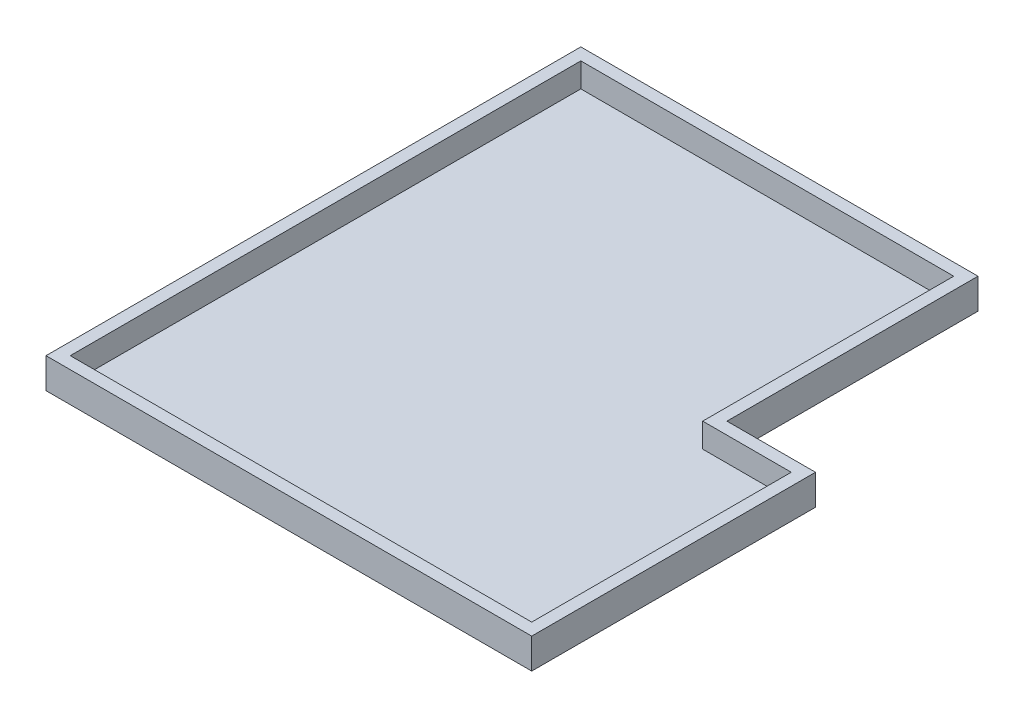
ISO-10303-21;
HEADER;
FILE_DESCRIPTION(('STEP AP214'),'2;1');
FILE_NAME('part.step','',(''),(''),'','','');
FILE_SCHEMA(('AUTOMOTIVE_DESIGN { 1 0 10303 214 1 1 1 1 }'));
ENDSEC;
DATA;
#1=APPLICATION_CONTEXT('core data for automotive mechanical design processes');
#2=APPLICATION_PROTOCOL_DEFINITION('international standard','automotive_design',2000,#1);
#3=PRODUCT_CONTEXT('',#1,'mechanical');
#4=PRODUCT('Part','Part','',(#3));
#5=PRODUCT_RELATED_PRODUCT_CATEGORY('part','',(#4));
#6=PRODUCT_DEFINITION_FORMATION('','',#4);
#7=PRODUCT_DEFINITION_CONTEXT('part definition',#1,'design');
#8=PRODUCT_DEFINITION('design','',#6,#7);
#9=PRODUCT_DEFINITION_SHAPE('','',#8);
#10=(LENGTH_UNIT() NAMED_UNIT(*) SI_UNIT(.MILLI.,.METRE.));
#11=(NAMED_UNIT(*) PLANE_ANGLE_UNIT() SI_UNIT($,.RADIAN.));
#12=(NAMED_UNIT(*) SI_UNIT($,.STERADIAN.) SOLID_ANGLE_UNIT());
#13=UNCERTAINTY_MEASURE_WITH_UNIT(LENGTH_MEASURE(1.E-05),#10,'distance_accuracy_value','');
#14=(GEOMETRIC_REPRESENTATION_CONTEXT(3) GLOBAL_UNCERTAINTY_ASSIGNED_CONTEXT((#13)) GLOBAL_UNIT_ASSIGNED_CONTEXT((#10,
#11,#12)) REPRESENTATION_CONTEXT('',''));
#15=CARTESIAN_POINT('',(0.,0.,0.));
#16=DIRECTION('',(0.,0.,1.));
#17=DIRECTION('',(1.,0.,0.));
#18=AXIS2_PLACEMENT_3D('',#15,#16,#17);
#19=CARTESIAN_POINT('',(1637.5,50.,-135.));
#20=DIRECTION('',(0.,0.,-1.));
#21=DIRECTION('',(-1.,0.,0.));
#22=AXIS2_PLACEMENT_3D('',#19,#20,#21);
#23=PLANE('',#22);
#24=DIRECTION('',(1.,0.,0.));
#25=VECTOR('',#24,1.);
#26=CARTESIAN_POINT('',(1637.5,0.,-135.));
#27=LINE('',#26,#25);
#28=CARTESIAN_POINT('',(1637.5,0.,-135.));
#29=VERTEX_POINT('',#28);
#30=CARTESIAN_POINT('',(2367.5,0.,-135.));
#31=VERTEX_POINT('',#30);
#32=EDGE_CURVE('E135',#29,#31,#27,.T.);
#33=ORIENTED_EDGE('',*,*,#32,.F.);
#34=DIRECTION('',(0.,-1.,0.));
#35=VECTOR('',#34,1.);
#36=CARTESIAN_POINT('',(1637.5,50.,-135.));
#37=LINE('',#36,#35);
#38=CARTESIAN_POINT('',(1637.5,250.,-135.));
#39=VERTEX_POINT('',#38);
#40=EDGE_CURVE('E11',#39,#29,#37,.T.);
#41=ORIENTED_EDGE('',*,*,#40,.F.);
#42=DIRECTION('',(1.,0.,0.));
#43=VECTOR('',#42,1.);
#44=CARTESIAN_POINT('',(0.,250.,-135.));
#45=LINE('',#44,#43);
#46=CARTESIAN_POINT('',(2367.5,250.,-135.));
#47=VERTEX_POINT('',#46);
#48=EDGE_CURVE('E134',#39,#47,#45,.T.);
#49=ORIENTED_EDGE('',*,*,#48,.T.);
#50=DIRECTION('',(0.,-1.,0.));
#51=VECTOR('',#50,1.);
#52=CARTESIAN_POINT('',(2367.5,50.,-135.));
#53=LINE('',#52,#51);
#54=EDGE_CURVE('E47',#47,#31,#53,.T.);
#55=ORIENTED_EDGE('',*,*,#54,.T.);
#56=EDGE_LOOP('',(#33,#41,#49,#55));
#57=FACE_BOUND('',#56,.T.);
#58=ADVANCED_FACE('F43',(#57),#23,.T.);
#59=CARTESIAN_POINT('',(1637.5,50.,-2205.));
#60=DIRECTION('',(1.,0.,0.));
#61=DIRECTION('',(0.,0.,-1.));
#62=AXIS2_PLACEMENT_3D('',#59,#60,#61);
#63=PLANE('',#62);
#64=DIRECTION('',(0.,0.,1.));
#65=VECTOR('',#64,1.);
#66=CARTESIAN_POINT('',(1637.5,0.,-2205.));
#67=LINE('',#66,#65);
#68=CARTESIAN_POINT('',(1637.5,0.,-2205.));
#69=VERTEX_POINT('',#68);
#70=EDGE_CURVE('E246',#69,#29,#67,.T.);
#71=ORIENTED_EDGE('',*,*,#70,.F.);
#72=DIRECTION('',(0.,-1.,0.));
#73=VECTOR('',#72,1.);
#74=CARTESIAN_POINT('',(1637.5,50.,-2205.));
#75=LINE('',#74,#73);
#76=CARTESIAN_POINT('',(1637.5,250.,-2205.));
#77=VERTEX_POINT('',#76);
#78=EDGE_CURVE('E53',#77,#69,#75,.T.);
#79=ORIENTED_EDGE('',*,*,#78,.F.);
#80=DIRECTION('',(0.,0.,1.));
#81=VECTOR('',#80,1.);
#82=CARTESIAN_POINT('',(1637.5,250.,-1.75651227325961E-13));
#83=LINE('',#82,#81);
#84=EDGE_CURVE('E146',#77,#39,#83,.T.);
#85=ORIENTED_EDGE('',*,*,#84,.T.);
#86=ORIENTED_EDGE('',*,*,#40,.T.);
#87=EDGE_LOOP('',(#71,#79,#85,#86));
#88=FACE_BOUND('',#87,.T.);
#89=ADVANCED_FACE('F153',(#88),#63,.T.);
#90=CARTESIAN_POINT('',(1537.5,50.,-2205.));
#91=DIRECTION('',(0.,0.,-1.));
#92=DIRECTION('',(-1.,0.,0.));
#93=AXIS2_PLACEMENT_3D('',#90,#91,#92);
#94=PLANE('',#93);
#95=DIRECTION('',(1.,0.,0.));
#96=VECTOR('',#95,1.);
#97=CARTESIAN_POINT('',(1537.5,0.,-2205.));
#98=LINE('',#97,#96);
#99=CARTESIAN_POINT('',(-1637.5,0.,-2205.));
#100=VERTEX_POINT('',#99);
#101=EDGE_CURVE('E242',#100,#69,#98,.T.);
#102=ORIENTED_EDGE('',*,*,#101,.F.);
#103=DIRECTION('',(0.,-1.,0.));
#104=VECTOR('',#103,1.);
#105=CARTESIAN_POINT('',(-1637.5,50.,-2205.));
#106=LINE('',#105,#104);
#107=CARTESIAN_POINT('',(-1637.5,250.,-2205.));
#108=VERTEX_POINT('',#107);
#109=EDGE_CURVE('E253',#108,#100,#106,.T.);
#110=ORIENTED_EDGE('',*,*,#109,.F.);
#111=DIRECTION('',(1.,0.,0.));
#112=VECTOR('',#111,1.);
#113=CARTESIAN_POINT('',(0.,250.,-2205.));
#114=LINE('',#113,#112);
#115=EDGE_CURVE('E155',#108,#77,#114,.T.);
#116=ORIENTED_EDGE('',*,*,#115,.T.);
#117=ORIENTED_EDGE('',*,*,#78,.T.);
#118=EDGE_LOOP('',(#102,#110,#116,#117));
#119=FACE_BOUND('',#118,.T.);
#120=ADVANCED_FACE('F270',(#119),#94,.T.);
#121=CARTESIAN_POINT('',(-1637.5,50.,-2105.));
#122=DIRECTION('',(-1.,0.,0.));
#123=DIRECTION('',(0.,0.,1.));
#124=AXIS2_PLACEMENT_3D('',#121,#122,#123);
#125=PLANE('',#124);
#126=DIRECTION('',(0.,0.,-1.));
#127=VECTOR('',#126,1.);
#128=CARTESIAN_POINT('',(-1637.5,0.,-2105.));
#129=LINE('',#128,#127);
#130=CARTESIAN_POINT('',(-1637.5,0.,2205.));
#131=VERTEX_POINT('',#130);
#132=EDGE_CURVE('E238',#131,#100,#129,.T.);
#133=ORIENTED_EDGE('',*,*,#132,.F.);
#134=DIRECTION('',(0.,-1.,0.));
#135=VECTOR('',#134,1.);
#136=CARTESIAN_POINT('',(-1637.5,50.,2205.));
#137=LINE('',#136,#135);
#138=CARTESIAN_POINT('',(-1637.5,250.,2205.));
#139=VERTEX_POINT('',#138);
#140=EDGE_CURVE('E257',#139,#131,#137,.T.);
#141=ORIENTED_EDGE('',*,*,#140,.F.);
#142=DIRECTION('',(0.,0.,-1.));
#143=VECTOR('',#142,1.);
#144=CARTESIAN_POINT('',(-1637.5,250.,0.));
#145=LINE('',#144,#143);
#146=EDGE_CURVE('E158',#139,#108,#145,.T.);
#147=ORIENTED_EDGE('',*,*,#146,.T.);
#148=ORIENTED_EDGE('',*,*,#109,.T.);
#149=EDGE_LOOP('',(#133,#141,#147,#148));
#150=FACE_BOUND('',#149,.T.);
#151=ADVANCED_FACE('F272',(#150),#125,.T.);
#152=CARTESIAN_POINT('',(-1637.5,50.,2205.));
#153=DIRECTION('',(0.,0.,-1.));
#154=DIRECTION('',(-1.,0.,0.));
#155=AXIS2_PLACEMENT_3D('',#152,#153,#154);
#156=PLANE('',#155);
#157=DIRECTION('',(1.,0.,0.));
#158=VECTOR('',#157,1.);
#159=CARTESIAN_POINT('',(-1637.5,0.,2205.));
#160=LINE('',#159,#158);
#161=CARTESIAN_POINT('',(2367.5,0.,2205.));
#162=VERTEX_POINT('',#161);
#163=EDGE_CURVE('E235',#131,#162,#160,.T.);
#164=ORIENTED_EDGE('',*,*,#163,.T.);
#165=DIRECTION('',(0.,-1.,0.));
#166=VECTOR('',#165,1.);
#167=CARTESIAN_POINT('',(2367.5,50.,2205.));
#168=LINE('',#167,#166);
#169=CARTESIAN_POINT('',(2367.5,250.,2205.));
#170=VERTEX_POINT('',#169);
#171=EDGE_CURVE('E260',#170,#162,#168,.T.);
#172=ORIENTED_EDGE('',*,*,#171,.F.);
#173=DIRECTION('',(1.,0.,0.));
#174=VECTOR('',#173,1.);
#175=CARTESIAN_POINT('',(0.,250.,2205.));
#176=LINE('',#175,#174);
#177=EDGE_CURVE('E164',#139,#170,#176,.T.);
#178=ORIENTED_EDGE('',*,*,#177,.F.);
#179=ORIENTED_EDGE('',*,*,#140,.T.);
#180=EDGE_LOOP('',(#164,#172,#178,#179));
#181=FACE_BOUND('',#180,.T.);
#182=ADVANCED_FACE('F276',(#181),#156,.F.);
#183=CARTESIAN_POINT('',(2367.5,50.,2205.));
#184=DIRECTION('',(-1.,0.,0.));
#185=DIRECTION('',(0.,0.,1.));
#186=AXIS2_PLACEMENT_3D('',#183,#184,#185);
#187=PLANE('',#186);
#188=DIRECTION('',(0.,0.,-1.));
#189=VECTOR('',#188,1.);
#190=CARTESIAN_POINT('',(2367.5,0.,2205.));
#191=LINE('',#190,#189);
#192=EDGE_CURVE('E231',#162,#31,#191,.T.);
#193=ORIENTED_EDGE('',*,*,#192,.T.);
#194=ORIENTED_EDGE('',*,*,#54,.F.);
#195=DIRECTION('',(0.,0.,-1.));
#196=VECTOR('',#195,1.);
#197=CARTESIAN_POINT('',(2367.5,250.,0.));
#198=LINE('',#197,#196);
#199=EDGE_CURVE('E150',#170,#47,#198,.T.);
#200=ORIENTED_EDGE('',*,*,#199,.F.);
#201=ORIENTED_EDGE('',*,*,#171,.T.);
#202=EDGE_LOOP('',(#193,#194,#200,#201));
#203=FACE_BOUND('',#202,.T.);
#204=ADVANCED_FACE('F45',(#203),#187,.F.);
#205=CARTESIAN_POINT('',(0.,0.,0.));
#206=DIRECTION('',(0.,1.,0.));
#207=DIRECTION('',(0.,0.,1.));
#208=AXIS2_PLACEMENT_3D('',#205,#206,#207);
#209=PLANE('',#208);
#210=ORIENTED_EDGE('',*,*,#32,.T.);
#211=ORIENTED_EDGE('',*,*,#192,.F.);
#212=ORIENTED_EDGE('',*,*,#163,.F.);
#213=ORIENTED_EDGE('',*,*,#132,.T.);
#214=ORIENTED_EDGE('',*,*,#101,.T.);
#215=ORIENTED_EDGE('',*,*,#70,.T.);
#216=EDGE_LOOP('',(#210,#211,#212,#213,#214,#215));
#217=FACE_BOUND('',#216,.T.);
#218=ADVANCED_FACE('F268',(#217),#209,.F.);
#219=CARTESIAN_POINT('',(0.,250.,-35.0000000000001));
#220=DIRECTION('',(0.,0.,-1.));
#221=DIRECTION('',(-1.,0.,0.));
#222=AXIS2_PLACEMENT_3D('',#219,#220,#221);
#223=PLANE('',#222);
#224=DIRECTION('',(-1.,0.,0.));
#225=VECTOR('',#224,1.);
#226=CARTESIAN_POINT('',(0.,50.,-35.0000000000001));
#227=LINE('',#226,#225);
#228=CARTESIAN_POINT('',(2267.5,50.,-35.0000000000001));
#229=VERTEX_POINT('',#228);
#230=CARTESIAN_POINT('',(1537.5,50.,-35.0000000000001));
#231=VERTEX_POINT('',#230);
#232=EDGE_CURVE('E228',#229,#231,#227,.T.);
#233=ORIENTED_EDGE('',*,*,#232,.F.);
#234=DIRECTION('',(0.,-1.,0.));
#235=VECTOR('',#234,1.);
#236=CARTESIAN_POINT('',(2267.5,250.,-35.0000000000001));
#237=LINE('',#236,#235);
#238=CARTESIAN_POINT('',(2267.5,250.,-35.0000000000001));
#239=VERTEX_POINT('',#238);
#240=EDGE_CURVE('E210',#239,#229,#237,.T.);
#241=ORIENTED_EDGE('',*,*,#240,.F.);
#242=DIRECTION('',(1.,0.,0.));
#243=VECTOR('',#242,1.);
#244=CARTESIAN_POINT('',(0.,250.,-35.0000000000001));
#245=LINE('',#244,#243);
#246=CARTESIAN_POINT('',(1537.5,250.,-35.0000000000001));
#247=VERTEX_POINT('',#246);
#248=EDGE_CURVE('E169',#247,#239,#245,.T.);
#249=ORIENTED_EDGE('',*,*,#248,.F.);
#250=DIRECTION('',(0.,-1.,0.));
#251=VECTOR('',#250,1.);
#252=CARTESIAN_POINT('',(1537.5,250.,-35.0000000000001));
#253=LINE('',#252,#251);
#254=EDGE_CURVE('E190',#247,#231,#253,.T.);
#255=ORIENTED_EDGE('',*,*,#254,.T.);
#256=EDGE_LOOP('',(#233,#241,#249,#255));
#257=FACE_BOUND('',#256,.T.);
#258=ADVANCED_FACE('F324',(#257),#223,.F.);
#259=CARTESIAN_POINT('',(2267.5,250.,0.));
#260=DIRECTION('',(-1.,0.,0.));
#261=DIRECTION('',(0.,0.,1.));
#262=AXIS2_PLACEMENT_3D('',#259,#260,#261);
#263=PLANE('',#262);
#264=ORIENTED_EDGE('',*,*,#240,.T.);
#265=DIRECTION('',(0.,0.,1.));
#266=VECTOR('',#265,1.);
#267=CARTESIAN_POINT('',(2267.5,50.,0.));
#268=LINE('',#267,#266);
#269=CARTESIAN_POINT('',(2267.5,50.,2105.));
#270=VERTEX_POINT('',#269);
#271=EDGE_CURVE('E61',#229,#270,#268,.T.);
#272=ORIENTED_EDGE('',*,*,#271,.T.);
#273=DIRECTION('',(0.,-1.,0.));
#274=VECTOR('',#273,1.);
#275=CARTESIAN_POINT('',(2267.5,250.,2105.));
#276=LINE('',#275,#274);
#277=CARTESIAN_POINT('',(2267.5,250.,2105.));
#278=VERTEX_POINT('',#277);
#279=EDGE_CURVE('E206',#278,#270,#276,.T.);
#280=ORIENTED_EDGE('',*,*,#279,.F.);
#281=DIRECTION('',(0.,0.,-1.));
#282=VECTOR('',#281,1.);
#283=CARTESIAN_POINT('',(2267.5,250.,0.));
#284=LINE('',#283,#282);
#285=EDGE_CURVE('E172',#278,#239,#284,.T.);
#286=ORIENTED_EDGE('',*,*,#285,.T.);
#287=EDGE_LOOP('',(#264,#272,#280,#286));
#288=FACE_BOUND('',#287,.T.);
#289=ADVANCED_FACE('F334',(#288),#263,.T.);
#290=CARTESIAN_POINT('',(0.,250.,2105.));
#291=DIRECTION('',(0.,0.,-1.));
#292=DIRECTION('',(-1.,0.,0.));
#293=AXIS2_PLACEMENT_3D('',#290,#291,#292);
#294=PLANE('',#293);
#295=ORIENTED_EDGE('',*,*,#279,.T.);
#296=DIRECTION('',(-1.,0.,0.));
#297=VECTOR('',#296,1.);
#298=CARTESIAN_POINT('',(0.,50.,2105.));
#299=LINE('',#298,#297);
#300=CARTESIAN_POINT('',(-1537.5,50.,2105.));
#301=VERTEX_POINT('',#300);
#302=EDGE_CURVE('E66',#270,#301,#299,.T.);
#303=ORIENTED_EDGE('',*,*,#302,.T.);
#304=DIRECTION('',(0.,-1.,0.));
#305=VECTOR('',#304,1.);
#306=CARTESIAN_POINT('',(-1537.5,250.,2105.));
#307=LINE('',#306,#305);
#308=CARTESIAN_POINT('',(-1537.5,250.,2105.));
#309=VERTEX_POINT('',#308);
#310=EDGE_CURVE('E202',#309,#301,#307,.T.);
#311=ORIENTED_EDGE('',*,*,#310,.F.);
#312=DIRECTION('',(1.,0.,0.));
#313=VECTOR('',#312,1.);
#314=CARTESIAN_POINT('',(0.,250.,2105.));
#315=LINE('',#314,#313);
#316=EDGE_CURVE('E176',#309,#278,#315,.T.);
#317=ORIENTED_EDGE('',*,*,#316,.T.);
#318=EDGE_LOOP('',(#295,#303,#311,#317));
#319=FACE_BOUND('',#318,.T.);
#320=ADVANCED_FACE('F346',(#319),#294,.T.);
#321=CARTESIAN_POINT('',(-1537.5,250.,0.));
#322=DIRECTION('',(-1.,0.,0.));
#323=DIRECTION('',(0.,0.,1.));
#324=AXIS2_PLACEMENT_3D('',#321,#322,#323);
#325=PLANE('',#324);
#326=DIRECTION('',(0.,0.,1.));
#327=VECTOR('',#326,1.);
#328=CARTESIAN_POINT('',(-1537.5,50.,0.));
#329=LINE('',#328,#327);
#330=CARTESIAN_POINT('',(-1537.5,50.,-2105.));
#331=VERTEX_POINT('',#330);
#332=EDGE_CURVE('E221',#331,#301,#329,.T.);
#333=ORIENTED_EDGE('',*,*,#332,.F.);
#334=DIRECTION('',(0.,-1.,0.));
#335=VECTOR('',#334,1.);
#336=CARTESIAN_POINT('',(-1537.5,250.,-2105.));
#337=LINE('',#336,#335);
#338=CARTESIAN_POINT('',(-1537.5,250.,-2105.));
#339=VERTEX_POINT('',#338);
#340=EDGE_CURVE('E198',#339,#331,#337,.T.);
#341=ORIENTED_EDGE('',*,*,#340,.F.);
#342=DIRECTION('',(0.,0.,-1.));
#343=VECTOR('',#342,1.);
#344=CARTESIAN_POINT('',(-1537.5,250.,0.));
#345=LINE('',#344,#343);
#346=EDGE_CURVE('E180',#309,#339,#345,.T.);
#347=ORIENTED_EDGE('',*,*,#346,.F.);
#348=ORIENTED_EDGE('',*,*,#310,.T.);
#349=EDGE_LOOP('',(#333,#341,#347,#348));
#350=FACE_BOUND('',#349,.T.);
#351=ADVANCED_FACE('F357',(#350),#325,.F.);
#352=CARTESIAN_POINT('',(0.,250.,-2105.));
#353=DIRECTION('',(0.,0.,-1.));
#354=DIRECTION('',(-1.,0.,0.));
#355=AXIS2_PLACEMENT_3D('',#352,#353,#354);
#356=PLANE('',#355);
#357=DIRECTION('',(-1.,0.,0.));
#358=VECTOR('',#357,1.);
#359=CARTESIAN_POINT('',(0.,50.,-2105.));
#360=LINE('',#359,#358);
#361=CARTESIAN_POINT('',(1537.5,50.,-2105.));
#362=VERTEX_POINT('',#361);
#363=EDGE_CURVE('E218',#362,#331,#360,.T.);
#364=ORIENTED_EDGE('',*,*,#363,.F.);
#365=DIRECTION('',(0.,-1.,0.));
#366=VECTOR('',#365,1.);
#367=CARTESIAN_POINT('',(1537.5,250.,-2105.));
#368=LINE('',#367,#366);
#369=CARTESIAN_POINT('',(1537.5,250.,-2105.));
#370=VERTEX_POINT('',#369);
#371=EDGE_CURVE('E194',#370,#362,#368,.T.);
#372=ORIENTED_EDGE('',*,*,#371,.F.);
#373=DIRECTION('',(1.,0.,0.));
#374=VECTOR('',#373,1.);
#375=CARTESIAN_POINT('',(0.,250.,-2105.));
#376=LINE('',#375,#374);
#377=EDGE_CURVE('E183',#339,#370,#376,.T.);
#378=ORIENTED_EDGE('',*,*,#377,.F.);
#379=ORIENTED_EDGE('',*,*,#340,.T.);
#380=EDGE_LOOP('',(#364,#372,#378,#379));
#381=FACE_BOUND('',#380,.T.);
#382=ADVANCED_FACE('F369',(#381),#356,.F.);
#383=CARTESIAN_POINT('',(1537.5,250.,0.));
#384=DIRECTION('',(-1.,0.,0.));
#385=DIRECTION('',(0.,0.,1.));
#386=AXIS2_PLACEMENT_3D('',#383,#384,#385);
#387=PLANE('',#386);
#388=ORIENTED_EDGE('',*,*,#371,.T.);
#389=DIRECTION('',(0.,0.,1.));
#390=VECTOR('',#389,1.);
#391=CARTESIAN_POINT('',(1537.5,50.,0.));
#392=LINE('',#391,#390);
#393=EDGE_CURVE('E214',#362,#231,#392,.T.);
#394=ORIENTED_EDGE('',*,*,#393,.T.);
#395=ORIENTED_EDGE('',*,*,#254,.F.);
#396=DIRECTION('',(0.,0.,-1.));
#397=VECTOR('',#396,1.);
#398=CARTESIAN_POINT('',(1537.5,250.,0.));
#399=LINE('',#398,#397);
#400=EDGE_CURVE('E186',#247,#370,#399,.T.);
#401=ORIENTED_EDGE('',*,*,#400,.T.);
#402=EDGE_LOOP('',(#388,#394,#395,#401));
#403=FACE_BOUND('',#402,.T.);
#404=ADVANCED_FACE('F380',(#403),#387,.T.);
#405=CARTESIAN_POINT('',(0.,250.,0.));
#406=DIRECTION('',(0.,1.,0.));
#407=DIRECTION('',(0.,0.,1.));
#408=AXIS2_PLACEMENT_3D('',#405,#406,#407);
#409=PLANE('',#408);
#410=ORIENTED_EDGE('',*,*,#48,.F.);
#411=ORIENTED_EDGE('',*,*,#84,.F.);
#412=ORIENTED_EDGE('',*,*,#115,.F.);
#413=ORIENTED_EDGE('',*,*,#146,.F.);
#414=ORIENTED_EDGE('',*,*,#177,.T.);
#415=ORIENTED_EDGE('',*,*,#199,.T.);
#416=EDGE_LOOP('',(#410,#411,#412,#413,#414,#415));
#417=FACE_BOUND('',#416,.T.);
#418=ORIENTED_EDGE('',*,*,#248,.T.);
#419=ORIENTED_EDGE('',*,*,#285,.F.);
#420=ORIENTED_EDGE('',*,*,#316,.F.);
#421=ORIENTED_EDGE('',*,*,#346,.T.);
#422=ORIENTED_EDGE('',*,*,#377,.T.);
#423=ORIENTED_EDGE('',*,*,#400,.F.);
#424=EDGE_LOOP('',(#418,#419,#420,#421,#422,#423));
#425=FACE_BOUND('',#424,.T.);
#426=ADVANCED_FACE('F143',(#417,#425),#409,.T.);
#427=CARTESIAN_POINT('',(0.,50.,0.));
#428=DIRECTION('',(0.,1.,0.));
#429=DIRECTION('',(0.,0.,1.));
#430=AXIS2_PLACEMENT_3D('',#427,#428,#429);
#431=PLANE('',#430);
#432=ORIENTED_EDGE('',*,*,#271,.F.);
#433=ORIENTED_EDGE('',*,*,#232,.T.);
#434=ORIENTED_EDGE('',*,*,#393,.F.);
#435=ORIENTED_EDGE('',*,*,#363,.T.);
#436=ORIENTED_EDGE('',*,*,#332,.T.);
#437=ORIENTED_EDGE('',*,*,#302,.F.);
#438=EDGE_LOOP('',(#432,#433,#434,#435,#436,#437));
#439=FACE_BOUND('',#438,.T.);
#440=ADVANCED_FACE('F401',(#439),#431,.T.);
#441=CLOSED_SHELL('',(#58,#89,#120,#151,#182,#204,#218,#258,#289,#320,#351,#382,#404,#426,#440));
#442=MANIFOLD_SOLID_BREP('B2',#441);
#443=ADVANCED_BREP_SHAPE_REPRESENTATION('',(#18,#442),#14);
#444=SHAPE_DEFINITION_REPRESENTATION(#9,#443);
ENDSEC;
END-ISO-10303-21;
